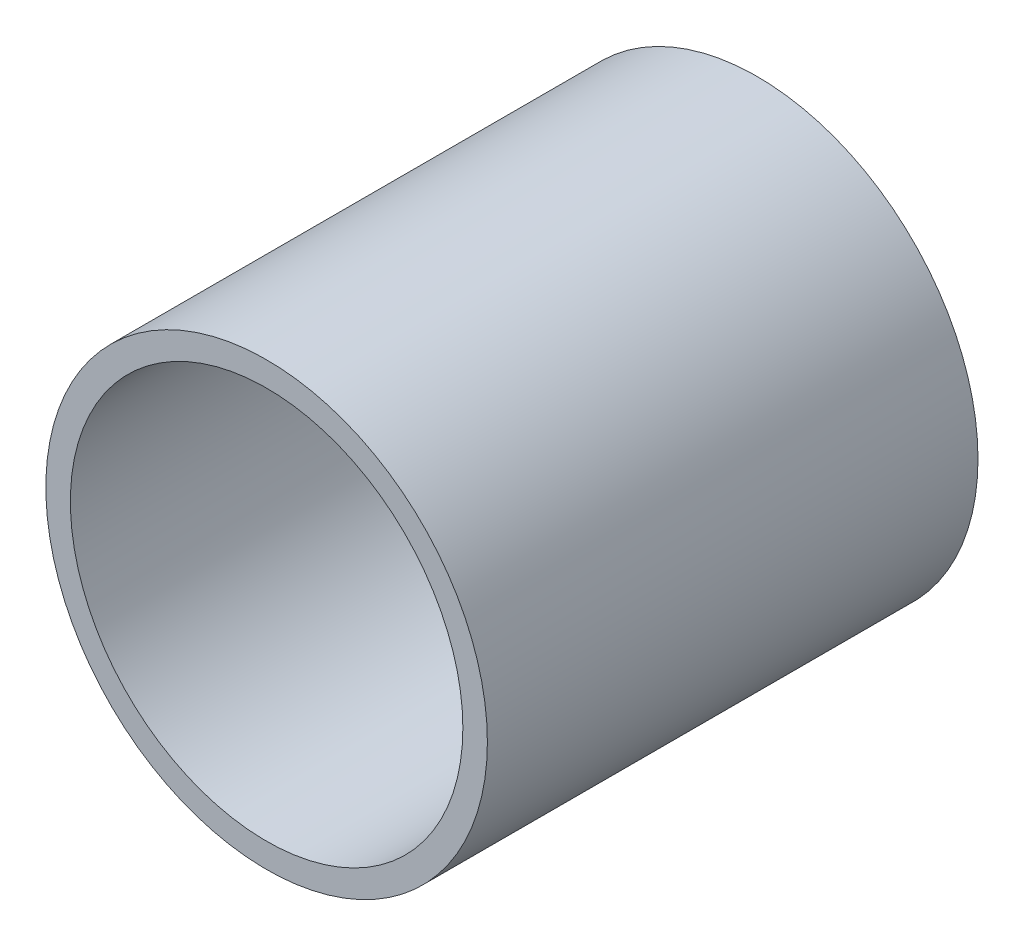
ISO-10303-21;
HEADER;
FILE_DESCRIPTION(('STEP AP214'),'2;1');
FILE_NAME('part.step','',(''),(''),'','','');
FILE_SCHEMA(('AUTOMOTIVE_DESIGN { 1 0 10303 214 1 1 1 1 }'));
ENDSEC;
DATA;
#1=APPLICATION_CONTEXT('core data for automotive mechanical design processes');
#2=APPLICATION_PROTOCOL_DEFINITION('international standard','automotive_design',2000,#1);
#3=PRODUCT_CONTEXT('',#1,'mechanical');
#4=PRODUCT('Part','Part','',(#3));
#5=PRODUCT_RELATED_PRODUCT_CATEGORY('part','',(#4));
#6=PRODUCT_DEFINITION_FORMATION('','',#4);
#7=PRODUCT_DEFINITION_CONTEXT('part definition',#1,'design');
#8=PRODUCT_DEFINITION('design','',#6,#7);
#9=PRODUCT_DEFINITION_SHAPE('','',#8);
#10=(LENGTH_UNIT() NAMED_UNIT(*) SI_UNIT(.MILLI.,.METRE.));
#11=(NAMED_UNIT(*) PLANE_ANGLE_UNIT() SI_UNIT($,.RADIAN.));
#12=(NAMED_UNIT(*) SI_UNIT($,.STERADIAN.) SOLID_ANGLE_UNIT());
#13=UNCERTAINTY_MEASURE_WITH_UNIT(LENGTH_MEASURE(1.E-05),#10,'distance_accuracy_value','');
#14=(GEOMETRIC_REPRESENTATION_CONTEXT(3) GLOBAL_UNCERTAINTY_ASSIGNED_CONTEXT((#13)) GLOBAL_UNIT_ASSIGNED_CONTEXT((#10,
#11,#12)) REPRESENTATION_CONTEXT('',''));
#15=CARTESIAN_POINT('',(0.,0.,0.));
#16=DIRECTION('',(0.,0.,1.));
#17=DIRECTION('',(1.,0.,0.));
#18=AXIS2_PLACEMENT_3D('',#15,#16,#17);
#19=CARTESIAN_POINT('',(0.,0.,20.));
#20=DIRECTION('',(0.,0.,1.));
#21=DIRECTION('',(1.,0.,0.));
#22=AXIS2_PLACEMENT_3D('',#19,#20,#21);
#23=PLANE('',#22);
#24=CARTESIAN_POINT('',(0.,0.,20.));
#25=DIRECTION('',(0.,0.,1.));
#26=DIRECTION('',(1.,0.,0.));
#27=AXIS2_PLACEMENT_3D('',#24,#25,#26);
#28=CIRCLE('',#27,9.);
#29=CARTESIAN_POINT('',(9.,0.,20.));
#30=VERTEX_POINT('',#29);
#31=EDGE_CURVE('E10',#30,#30,#28,.T.);
#32=ORIENTED_EDGE('',*,*,#31,.T.);
#33=EDGE_LOOP('',(#32));
#34=FACE_BOUND('',#33,.T.);
#35=CARTESIAN_POINT('',(0.,0.,20.));
#36=DIRECTION('',(0.,0.,1.));
#37=DIRECTION('',(1.,0.,0.));
#38=AXIS2_PLACEMENT_3D('',#35,#36,#37);
#39=CIRCLE('',#38,8.);
#40=CARTESIAN_POINT('',(8.,0.,20.));
#41=VERTEX_POINT('',#40);
#42=EDGE_CURVE('E56',#41,#41,#39,.T.);
#43=ORIENTED_EDGE('',*,*,#42,.F.);
#44=EDGE_LOOP('',(#43));
#45=FACE_BOUND('',#44,.T.);
#46=ADVANCED_FACE('F43',(#34,#45),#23,.T.);
#47=CARTESIAN_POINT('',(0.,0.,0.));
#48=DIRECTION('',(0.,0.,1.));
#49=DIRECTION('',(1.,0.,0.));
#50=AXIS2_PLACEMENT_3D('',#47,#48,#49);
#51=PLANE('',#50);
#52=CARTESIAN_POINT('',(0.,0.,0.));
#53=DIRECTION('',(0.,0.,1.));
#54=DIRECTION('',(1.,0.,0.));
#55=AXIS2_PLACEMENT_3D('',#52,#53,#54);
#56=CIRCLE('',#55,9.);
#57=CARTESIAN_POINT('',(9.,0.,0.));
#58=VERTEX_POINT('',#57);
#59=EDGE_CURVE('E47',#58,#58,#56,.T.);
#60=ORIENTED_EDGE('',*,*,#59,.F.);
#61=EDGE_LOOP('',(#60));
#62=FACE_BOUND('',#61,.T.);
#63=CARTESIAN_POINT('',(0.,0.,0.));
#64=DIRECTION('',(0.,0.,1.));
#65=DIRECTION('',(1.,0.,0.));
#66=AXIS2_PLACEMENT_3D('',#63,#64,#65);
#67=CIRCLE('',#66,8.);
#68=CARTESIAN_POINT('',(8.,0.,0.));
#69=VERTEX_POINT('',#68);
#70=EDGE_CURVE('E58',#69,#69,#67,.T.);
#71=ORIENTED_EDGE('',*,*,#70,.T.);
#72=EDGE_LOOP('',(#71));
#73=FACE_BOUND('',#72,.T.);
#74=ADVANCED_FACE('F70',(#62,#73),#51,.F.);
#75=CARTESIAN_POINT('',(0.,0.,20.));
#76=DIRECTION('',(0.,0.,-1.));
#77=DIRECTION('',(-1.,0.,0.));
#78=AXIS2_PLACEMENT_3D('',#75,#76,#77);
#79=CYLINDRICAL_SURFACE('',#78,9.);
#80=ORIENTED_EDGE('',*,*,#31,.F.);
#81=EDGE_LOOP('',(#80));
#82=FACE_BOUND('',#81,.T.);
#83=ORIENTED_EDGE('',*,*,#59,.T.);
#84=EDGE_LOOP('',(#83));
#85=FACE_BOUND('',#84,.T.);
#86=ADVANCED_FACE('F45',(#82,#85),#79,.T.);
#87=CARTESIAN_POINT('',(0.,0.,20.));
#88=DIRECTION('',(0.,0.,-1.));
#89=DIRECTION('',(-1.,0.,0.));
#90=AXIS2_PLACEMENT_3D('',#87,#88,#89);
#91=CYLINDRICAL_SURFACE('',#90,8.);
#92=ORIENTED_EDGE('',*,*,#42,.T.);
#93=EDGE_LOOP('',(#92));
#94=FACE_BOUND('',#93,.T.);
#95=ORIENTED_EDGE('',*,*,#70,.F.);
#96=EDGE_LOOP('',(#95));
#97=FACE_BOUND('',#96,.T.);
#98=ADVANCED_FACE('F66',(#94,#97),#91,.F.);
#99=CLOSED_SHELL('',(#46,#74,#86,#98));
#100=MANIFOLD_SOLID_BREP('B2',#99);
#101=ADVANCED_BREP_SHAPE_REPRESENTATION('',(#18,#100),#14);
#102=SHAPE_DEFINITION_REPRESENTATION(#9,#101);
ENDSEC;
END-ISO-10303-21;
